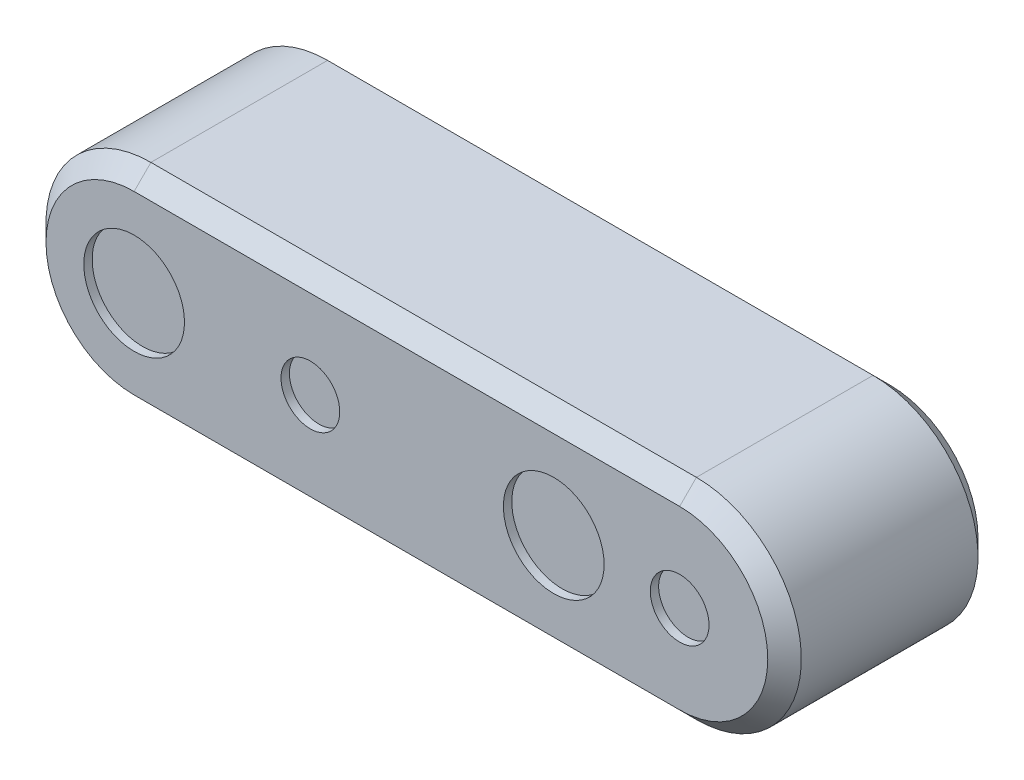
ISO-10303-21;
HEADER;
FILE_DESCRIPTION(('STEP AP214'),'2;1');
FILE_NAME('part.step','',(''),(''),'','','');
FILE_SCHEMA(('AUTOMOTIVE_DESIGN { 1 0 10303 214 1 1 1 1 }'));
ENDSEC;
DATA;
#1=APPLICATION_CONTEXT('core data for automotive mechanical design processes');
#2=APPLICATION_PROTOCOL_DEFINITION('international standard','automotive_design',2000,#1);
#3=PRODUCT_CONTEXT('',#1,'mechanical');
#4=PRODUCT('Part','Part','',(#3));
#5=PRODUCT_RELATED_PRODUCT_CATEGORY('part','',(#4));
#6=PRODUCT_DEFINITION_FORMATION('','',#4);
#7=PRODUCT_DEFINITION_CONTEXT('part definition',#1,'design');
#8=PRODUCT_DEFINITION('design','',#6,#7);
#9=PRODUCT_DEFINITION_SHAPE('','',#8);
#10=(LENGTH_UNIT() NAMED_UNIT(*) SI_UNIT(.MILLI.,.METRE.));
#11=(NAMED_UNIT(*) PLANE_ANGLE_UNIT() SI_UNIT($,.RADIAN.));
#12=(NAMED_UNIT(*) SI_UNIT($,.STERADIAN.) SOLID_ANGLE_UNIT());
#13=UNCERTAINTY_MEASURE_WITH_UNIT(LENGTH_MEASURE(1.E-05),#10,'distance_accuracy_value','');
#14=(GEOMETRIC_REPRESENTATION_CONTEXT(3) GLOBAL_UNCERTAINTY_ASSIGNED_CONTEXT((#13)) GLOBAL_UNIT_ASSIGNED_CONTEXT((#10,
#11,#12)) REPRESENTATION_CONTEXT('',''));
#15=CARTESIAN_POINT('',(0.,0.,0.));
#16=DIRECTION('',(0.,0.,1.));
#17=DIRECTION('',(1.,0.,0.));
#18=AXIS2_PLACEMENT_3D('',#15,#16,#17);
#19=CARTESIAN_POINT('',(-32.5,0.,-12.525));
#20=DIRECTION('',(0.,0.,1.));
#21=DIRECTION('',(1.,0.,0.));
#22=AXIS2_PLACEMENT_3D('',#19,#20,#21);
#23=CYLINDRICAL_SURFACE('',#22,12.5);
#24=DIRECTION('',(0.,0.,1.));
#25=VECTOR('',#24,1.);
#26=CARTESIAN_POINT('',(-32.5,12.5,-12.525));
#27=LINE('',#26,#25);
#28=CARTESIAN_POINT('',(-32.5,12.5,-10.525));
#29=VERTEX_POINT('',#28);
#30=CARTESIAN_POINT('',(-32.5,12.5,10.525));
#31=VERTEX_POINT('',#30);
#32=EDGE_CURVE('E152',#29,#31,#27,.T.);
#33=ORIENTED_EDGE('',*,*,#32,.F.);
#34=CARTESIAN_POINT('',(-32.5,0.,-10.525));
#35=DIRECTION('',(0.,0.,1.));
#36=DIRECTION('',(1.,0.,0.));
#37=AXIS2_PLACEMENT_3D('',#34,#35,#36);
#38=CIRCLE('',#37,12.5);
#39=CARTESIAN_POINT('',(-32.5,-12.5,-10.525));
#40=VERTEX_POINT('',#39);
#41=EDGE_CURVE('E167',#29,#40,#38,.T.);
#42=ORIENTED_EDGE('',*,*,#41,.T.);
#43=DIRECTION('',(0.,0.,1.));
#44=VECTOR('',#43,1.);
#45=CARTESIAN_POINT('',(-32.5,-12.5,-12.525));
#46=LINE('',#45,#44);
#47=CARTESIAN_POINT('',(-32.5,-12.5,10.525));
#48=VERTEX_POINT('',#47);
#49=EDGE_CURVE('E143',#40,#48,#46,.T.);
#50=ORIENTED_EDGE('',*,*,#49,.T.);
#51=CARTESIAN_POINT('',(-32.5,0.,10.525));
#52=DIRECTION('',(0.,0.,1.));
#53=DIRECTION('',(1.,0.,0.));
#54=AXIS2_PLACEMENT_3D('',#51,#52,#53);
#55=CIRCLE('',#54,12.5);
#56=EDGE_CURVE('E133',#48,#31,#55,.F.);
#57=ORIENTED_EDGE('',*,*,#56,.T.);
#58=EDGE_LOOP('',(#33,#42,#50,#57));
#59=FACE_BOUND('',#58,.T.);
#60=ADVANCED_FACE('F42',(#59),#23,.T.);
#61=CARTESIAN_POINT('',(-32.5,12.5,-12.525));
#62=DIRECTION('',(0.,1.,0.));
#63=DIRECTION('',(0.,0.,1.));
#64=AXIS2_PLACEMENT_3D('',#61,#62,#63);
#65=PLANE('',#64);
#66=DIRECTION('',(0.,0.,1.));
#67=VECTOR('',#66,1.);
#68=CARTESIAN_POINT('',(32.5,12.5,-12.525));
#69=LINE('',#68,#67);
#70=CARTESIAN_POINT('',(32.5,12.5,-10.525));
#71=VERTEX_POINT('',#70);
#72=CARTESIAN_POINT('',(32.5,12.5,10.525));
#73=VERTEX_POINT('',#72);
#74=EDGE_CURVE('E150',#71,#73,#69,.T.);
#75=ORIENTED_EDGE('',*,*,#74,.F.);
#76=DIRECTION('',(-1.,0.,0.));
#77=VECTOR('',#76,1.);
#78=CARTESIAN_POINT('',(-32.5,12.5,-10.525));
#79=LINE('',#78,#77);
#80=EDGE_CURVE('E171',#71,#29,#79,.T.);
#81=ORIENTED_EDGE('',*,*,#80,.T.);
#82=ORIENTED_EDGE('',*,*,#32,.T.);
#83=DIRECTION('',(1.,0.,0.));
#84=VECTOR('',#83,1.);
#85=CARTESIAN_POINT('',(-32.5,12.5,10.525));
#86=LINE('',#85,#84);
#87=EDGE_CURVE('E169',#31,#73,#86,.T.);
#88=ORIENTED_EDGE('',*,*,#87,.T.);
#89=EDGE_LOOP('',(#75,#81,#82,#88));
#90=FACE_BOUND('',#89,.T.);
#91=ADVANCED_FACE('F199',(#90),#65,.T.);
#92=CARTESIAN_POINT('',(32.5,0.,-12.525));
#93=DIRECTION('',(0.,0.,1.));
#94=DIRECTION('',(1.,0.,0.));
#95=AXIS2_PLACEMENT_3D('',#92,#93,#94);
#96=CYLINDRICAL_SURFACE('',#95,12.5);
#97=DIRECTION('',(0.,0.,1.));
#98=VECTOR('',#97,1.);
#99=CARTESIAN_POINT('',(32.5,-12.5,-12.525));
#100=LINE('',#99,#98);
#101=CARTESIAN_POINT('',(32.5,-12.5,-10.525));
#102=VERTEX_POINT('',#101);
#103=CARTESIAN_POINT('',(32.5,-12.5,10.525));
#104=VERTEX_POINT('',#103);
#105=EDGE_CURVE('E141',#102,#104,#100,.T.);
#106=ORIENTED_EDGE('',*,*,#105,.F.);
#107=CARTESIAN_POINT('',(32.5,0.,-10.525));
#108=DIRECTION('',(0.,0.,1.));
#109=DIRECTION('',(1.,0.,0.));
#110=AXIS2_PLACEMENT_3D('',#107,#108,#109);
#111=CIRCLE('',#110,12.5);
#112=EDGE_CURVE('E125',#102,#71,#111,.T.);
#113=ORIENTED_EDGE('',*,*,#112,.T.);
#114=ORIENTED_EDGE('',*,*,#74,.T.);
#115=CARTESIAN_POINT('',(32.5,0.,10.525));
#116=DIRECTION('',(0.,0.,1.));
#117=DIRECTION('',(1.,0.,0.));
#118=AXIS2_PLACEMENT_3D('',#115,#116,#117);
#119=CIRCLE('',#118,12.5);
#120=EDGE_CURVE('E134',#73,#104,#119,.F.);
#121=ORIENTED_EDGE('',*,*,#120,.T.);
#122=EDGE_LOOP('',(#106,#113,#114,#121));
#123=FACE_BOUND('',#122,.T.);
#124=ADVANCED_FACE('F148',(#123),#96,.T.);
#125=CARTESIAN_POINT('',(-32.5,-12.5,-12.525));
#126=DIRECTION('',(0.,-1.,0.));
#127=DIRECTION('',(0.,0.,-1.));
#128=AXIS2_PLACEMENT_3D('',#125,#126,#127);
#129=PLANE('',#128);
#130=ORIENTED_EDGE('',*,*,#49,.F.);
#131=DIRECTION('',(1.,0.,0.));
#132=VECTOR('',#131,1.);
#133=CARTESIAN_POINT('',(32.5,-12.5,-10.525));
#134=LINE('',#133,#132);
#135=EDGE_CURVE('E117',#40,#102,#134,.T.);
#136=ORIENTED_EDGE('',*,*,#135,.T.);
#137=ORIENTED_EDGE('',*,*,#105,.T.);
#138=DIRECTION('',(-1.,0.,0.));
#139=VECTOR('',#138,1.);
#140=CARTESIAN_POINT('',(-32.5,-12.5,10.525));
#141=LINE('',#140,#139);
#142=EDGE_CURVE('E146',#104,#48,#141,.T.);
#143=ORIENTED_EDGE('',*,*,#142,.T.);
#144=EDGE_LOOP('',(#130,#136,#137,#143));
#145=FACE_BOUND('',#144,.T.);
#146=ADVANCED_FACE('F139',(#145),#129,.T.);
#147=CARTESIAN_POINT('',(-32.5,0.,-12.525));
#148=DIRECTION('',(0.,0.,1.));
#149=DIRECTION('',(1.,0.,0.));
#150=AXIS2_PLACEMENT_3D('',#147,#148,#149);
#151=PLANE('',#150);
#152=CARTESIAN_POINT('',(32.5,0.,-12.525));
#153=DIRECTION('',(0.,0.,1.));
#154=DIRECTION('',(1.,0.,0.));
#155=AXIS2_PLACEMENT_3D('',#152,#153,#154);
#156=CIRCLE('',#155,10.5);
#157=CARTESIAN_POINT('',(32.5,10.5,-12.525));
#158=VERTEX_POINT('',#157);
#159=CARTESIAN_POINT('',(32.5,-10.5,-12.525));
#160=VERTEX_POINT('',#159);
#161=EDGE_CURVE('E162',#158,#160,#156,.F.);
#162=ORIENTED_EDGE('',*,*,#161,.T.);
#163=DIRECTION('',(-1.,0.,0.));
#164=VECTOR('',#163,1.);
#165=CARTESIAN_POINT('',(-32.5,-10.5,-12.525));
#166=LINE('',#165,#164);
#167=CARTESIAN_POINT('',(-32.5,-10.5,-12.525));
#168=VERTEX_POINT('',#167);
#169=EDGE_CURVE('E119',#160,#168,#166,.T.);
#170=ORIENTED_EDGE('',*,*,#169,.T.);
#171=CARTESIAN_POINT('',(-32.5,0.,-12.525));
#172=DIRECTION('',(0.,0.,1.));
#173=DIRECTION('',(1.,0.,0.));
#174=AXIS2_PLACEMENT_3D('',#171,#172,#173);
#175=CIRCLE('',#174,10.5);
#176=CARTESIAN_POINT('',(-32.5,10.5,-12.525));
#177=VERTEX_POINT('',#176);
#178=EDGE_CURVE('E160',#168,#177,#175,.F.);
#179=ORIENTED_EDGE('',*,*,#178,.T.);
#180=DIRECTION('',(1.,0.,0.));
#181=VECTOR('',#180,1.);
#182=CARTESIAN_POINT('',(32.5,10.5,-12.525));
#183=LINE('',#182,#181);
#184=EDGE_CURVE('E145',#177,#158,#183,.T.);
#185=ORIENTED_EDGE('',*,*,#184,.T.);
#186=EDGE_LOOP('',(#162,#170,#179,#185));
#187=FACE_BOUND('',#186,.T.);
#188=CARTESIAN_POINT('',(22.5,0.,-12.525));
#189=DIRECTION('',(0.,0.,-1.));
#190=DIRECTION('',(-1.,0.,0.));
#191=AXIS2_PLACEMENT_3D('',#188,#189,#190);
#192=CIRCLE('',#191,1.6);
#193=CARTESIAN_POINT('',(20.9,0.,-12.525));
#194=VERTEX_POINT('',#193);
#195=EDGE_CURVE('E234',#194,#194,#192,.T.);
#196=ORIENTED_EDGE('',*,*,#195,.F.);
#197=EDGE_LOOP('',(#196));
#198=FACE_BOUND('',#197,.T.);
#199=CARTESIAN_POINT('',(-22.5,0.,-12.525));
#200=DIRECTION('',(0.,0.,-1.));
#201=DIRECTION('',(-1.,0.,0.));
#202=AXIS2_PLACEMENT_3D('',#199,#200,#201);
#203=CIRCLE('',#202,1.6);
#204=CARTESIAN_POINT('',(-24.1,0.,-12.525));
#205=VERTEX_POINT('',#204);
#206=EDGE_CURVE('E231',#205,#205,#203,.T.);
#207=ORIENTED_EDGE('',*,*,#206,.F.);
#208=EDGE_LOOP('',(#207));
#209=FACE_BOUND('',#208,.T.);
#210=ADVANCED_FACE('F249',(#187,#198,#209),#151,.F.);
#211=CARTESIAN_POINT('',(-32.5,0.,12.525));
#212=DIRECTION('',(0.,0.,1.));
#213=DIRECTION('',(1.,0.,0.));
#214=AXIS2_PLACEMENT_3D('',#211,#212,#213);
#215=PLANE('',#214);
#216=CARTESIAN_POINT('',(-32.5,0.,12.525));
#217=DIRECTION('',(0.,0.,1.));
#218=DIRECTION('',(1.,0.,0.));
#219=AXIS2_PLACEMENT_3D('',#216,#217,#218);
#220=CIRCLE('',#219,10.5);
#221=CARTESIAN_POINT('',(-32.5,10.5,12.525));
#222=VERTEX_POINT('',#221);
#223=CARTESIAN_POINT('',(-32.5,-10.5,12.525));
#224=VERTEX_POINT('',#223);
#225=EDGE_CURVE('E67',#222,#224,#220,.T.);
#226=ORIENTED_EDGE('',*,*,#225,.T.);
#227=DIRECTION('',(1.,0.,0.));
#228=VECTOR('',#227,1.);
#229=CARTESIAN_POINT('',(-32.5,-10.5,12.525));
#230=LINE('',#229,#228);
#231=CARTESIAN_POINT('',(32.5,-10.5,12.525));
#232=VERTEX_POINT('',#231);
#233=EDGE_CURVE('E11',#224,#232,#230,.T.);
#234=ORIENTED_EDGE('',*,*,#233,.T.);
#235=CARTESIAN_POINT('',(32.5,0.,12.525));
#236=DIRECTION('',(0.,0.,1.));
#237=DIRECTION('',(1.,0.,0.));
#238=AXIS2_PLACEMENT_3D('',#235,#236,#237);
#239=CIRCLE('',#238,10.5);
#240=CARTESIAN_POINT('',(32.5,10.5,12.525));
#241=VERTEX_POINT('',#240);
#242=EDGE_CURVE('E52',#232,#241,#239,.T.);
#243=ORIENTED_EDGE('',*,*,#242,.T.);
#244=DIRECTION('',(-1.,0.,0.));
#245=VECTOR('',#244,1.);
#246=CARTESIAN_POINT('',(-32.5,10.5,12.525));
#247=LINE('',#246,#245);
#248=EDGE_CURVE('E173',#241,#222,#247,.T.);
#249=ORIENTED_EDGE('',*,*,#248,.T.);
#250=EDGE_LOOP('',(#226,#234,#243,#249));
#251=FACE_BOUND('',#250,.T.);
#252=CARTESIAN_POINT('',(-32.5,0.,12.525));
#253=DIRECTION('',(0.,0.,1.));
#254=DIRECTION('',(1.,0.,0.));
#255=AXIS2_PLACEMENT_3D('',#252,#253,#254);
#256=CIRCLE('',#255,6.);
#257=CARTESIAN_POINT('',(-26.5,0.,12.525));
#258=VERTEX_POINT('',#257);
#259=EDGE_CURVE('E224',#258,#258,#256,.T.);
#260=ORIENTED_EDGE('',*,*,#259,.F.);
#261=EDGE_LOOP('',(#260));
#262=FACE_BOUND('',#261,.T.);
#263=CARTESIAN_POINT('',(-11.5,0.,12.525));
#264=DIRECTION('',(0.,0.,1.));
#265=DIRECTION('',(1.,0.,0.));
#266=AXIS2_PLACEMENT_3D('',#263,#264,#265);
#267=CIRCLE('',#266,3.5);
#268=CARTESIAN_POINT('',(-8.,0.,12.525));
#269=VERTEX_POINT('',#268);
#270=EDGE_CURVE('E221',#269,#269,#267,.T.);
#271=ORIENTED_EDGE('',*,*,#270,.F.);
#272=EDGE_LOOP('',(#271));
#273=FACE_BOUND('',#272,.T.);
#274=CARTESIAN_POINT('',(17.5,0.,12.525));
#275=DIRECTION('',(0.,0.,1.));
#276=DIRECTION('',(1.,0.,0.));
#277=AXIS2_PLACEMENT_3D('',#274,#275,#276);
#278=CIRCLE('',#277,6.);
#279=CARTESIAN_POINT('',(23.5,0.,12.525));
#280=VERTEX_POINT('',#279);
#281=EDGE_CURVE('E215',#280,#280,#278,.T.);
#282=ORIENTED_EDGE('',*,*,#281,.F.);
#283=EDGE_LOOP('',(#282));
#284=FACE_BOUND('',#283,.T.);
#285=CARTESIAN_POINT('',(32.5,0.,12.525));
#286=DIRECTION('',(0.,0.,1.));
#287=DIRECTION('',(1.,0.,0.));
#288=AXIS2_PLACEMENT_3D('',#285,#286,#287);
#289=CIRCLE('',#288,3.5);
#290=CARTESIAN_POINT('',(36.,0.,12.525));
#291=VERTEX_POINT('',#290);
#292=EDGE_CURVE('E208',#291,#291,#289,.T.);
#293=ORIENTED_EDGE('',*,*,#292,.F.);
#294=EDGE_LOOP('',(#293));
#295=FACE_BOUND('',#294,.T.);
#296=ADVANCED_FACE('F252',(#251,#262,#273,#284,#295),#215,.T.);
#297=CARTESIAN_POINT('',(32.5,0.,11.525));
#298=DIRECTION('',(0.,0.,1.));
#299=DIRECTION('',(1.,0.,0.));
#300=AXIS2_PLACEMENT_3D('',#297,#298,#299);
#301=CYLINDRICAL_SURFACE('',#300,3.5);
#302=CARTESIAN_POINT('',(32.5,0.,11.525));
#303=DIRECTION('',(0.,0.,1.));
#304=DIRECTION('',(1.,0.,0.));
#305=AXIS2_PLACEMENT_3D('',#302,#303,#304);
#306=CIRCLE('',#305,3.5);
#307=CARTESIAN_POINT('',(36.,0.,11.525));
#308=VERTEX_POINT('',#307);
#309=EDGE_CURVE('E205',#308,#308,#306,.T.);
#310=ORIENTED_EDGE('',*,*,#309,.F.);
#311=EDGE_LOOP('',(#310));
#312=FACE_BOUND('',#311,.T.);
#313=ORIENTED_EDGE('',*,*,#292,.T.);
#314=EDGE_LOOP('',(#313));
#315=FACE_BOUND('',#314,.T.);
#316=ADVANCED_FACE('F433',(#312,#315),#301,.F.);
#317=CARTESIAN_POINT('',(32.5,0.,11.525));
#318=DIRECTION('',(0.,0.,1.));
#319=DIRECTION('',(1.,0.,0.));
#320=AXIS2_PLACEMENT_3D('',#317,#318,#319);
#321=PLANE('',#320);
#322=ORIENTED_EDGE('',*,*,#309,.T.);
#323=EDGE_LOOP('',(#322));
#324=FACE_BOUND('',#323,.T.);
#325=ADVANCED_FACE('F422',(#324),#321,.T.);
#326=CARTESIAN_POINT('',(17.5,0.,11.525));
#327=DIRECTION('',(0.,0.,1.));
#328=DIRECTION('',(1.,0.,0.));
#329=AXIS2_PLACEMENT_3D('',#326,#327,#328);
#330=CYLINDRICAL_SURFACE('',#329,6.);
#331=CARTESIAN_POINT('',(17.5,0.,11.525));
#332=DIRECTION('',(0.,0.,1.));
#333=DIRECTION('',(1.,0.,0.));
#334=AXIS2_PLACEMENT_3D('',#331,#332,#333);
#335=CIRCLE('',#334,6.);
#336=CARTESIAN_POINT('',(23.5,0.,11.525));
#337=VERTEX_POINT('',#336);
#338=EDGE_CURVE('E212',#337,#337,#335,.T.);
#339=ORIENTED_EDGE('',*,*,#338,.F.);
#340=EDGE_LOOP('',(#339));
#341=FACE_BOUND('',#340,.T.);
#342=ORIENTED_EDGE('',*,*,#281,.T.);
#343=EDGE_LOOP('',(#342));
#344=FACE_BOUND('',#343,.T.);
#345=ADVANCED_FACE('F411',(#341,#344),#330,.F.);
#346=CARTESIAN_POINT('',(17.5,0.,11.525));
#347=DIRECTION('',(0.,0.,1.));
#348=DIRECTION('',(1.,0.,0.));
#349=AXIS2_PLACEMENT_3D('',#346,#347,#348);
#350=PLANE('',#349);
#351=ORIENTED_EDGE('',*,*,#338,.T.);
#352=EDGE_LOOP('',(#351));
#353=FACE_BOUND('',#352,.T.);
#354=ADVANCED_FACE('F400',(#353),#350,.T.);
#355=CARTESIAN_POINT('',(-11.5,0.,11.525));
#356=DIRECTION('',(0.,0.,1.));
#357=DIRECTION('',(1.,0.,0.));
#358=AXIS2_PLACEMENT_3D('',#355,#356,#357);
#359=CYLINDRICAL_SURFACE('',#358,3.5);
#360=CARTESIAN_POINT('',(-11.5,0.,11.525));
#361=DIRECTION('',(0.,0.,1.));
#362=DIRECTION('',(1.,0.,0.));
#363=AXIS2_PLACEMENT_3D('',#360,#361,#362);
#364=CIRCLE('',#363,3.5);
#365=CARTESIAN_POINT('',(-8.,0.,11.525));
#366=VERTEX_POINT('',#365);
#367=EDGE_CURVE('E218',#366,#366,#364,.T.);
#368=ORIENTED_EDGE('',*,*,#367,.F.);
#369=EDGE_LOOP('',(#368));
#370=FACE_BOUND('',#369,.T.);
#371=ORIENTED_EDGE('',*,*,#270,.T.);
#372=EDGE_LOOP('',(#371));
#373=FACE_BOUND('',#372,.T.);
#374=ADVANCED_FACE('F389',(#370,#373),#359,.F.);
#375=CARTESIAN_POINT('',(-11.5,0.,11.525));
#376=DIRECTION('',(0.,0.,1.));
#377=DIRECTION('',(1.,0.,0.));
#378=AXIS2_PLACEMENT_3D('',#375,#376,#377);
#379=PLANE('',#378);
#380=ORIENTED_EDGE('',*,*,#367,.T.);
#381=EDGE_LOOP('',(#380));
#382=FACE_BOUND('',#381,.T.);
#383=ADVANCED_FACE('F378',(#382),#379,.T.);
#384=CARTESIAN_POINT('',(-32.5,0.,11.525));
#385=DIRECTION('',(0.,0.,1.));
#386=DIRECTION('',(1.,0.,0.));
#387=AXIS2_PLACEMENT_3D('',#384,#385,#386);
#388=CYLINDRICAL_SURFACE('',#387,6.);
#389=CARTESIAN_POINT('',(-32.5,0.,11.525));
#390=DIRECTION('',(0.,0.,1.));
#391=DIRECTION('',(1.,0.,0.));
#392=AXIS2_PLACEMENT_3D('',#389,#390,#391);
#393=CIRCLE('',#392,6.);
#394=CARTESIAN_POINT('',(-26.5,0.,11.525));
#395=VERTEX_POINT('',#394);
#396=EDGE_CURVE('E154',#395,#395,#393,.T.);
#397=ORIENTED_EDGE('',*,*,#396,.F.);
#398=EDGE_LOOP('',(#397));
#399=FACE_BOUND('',#398,.T.);
#400=ORIENTED_EDGE('',*,*,#259,.T.);
#401=EDGE_LOOP('',(#400));
#402=FACE_BOUND('',#401,.T.);
#403=ADVANCED_FACE('F268',(#399,#402),#388,.F.);
#404=CARTESIAN_POINT('',(-32.5,0.,11.525));
#405=DIRECTION('',(0.,0.,1.));
#406=DIRECTION('',(1.,0.,0.));
#407=AXIS2_PLACEMENT_3D('',#404,#405,#406);
#408=PLANE('',#407);
#409=ORIENTED_EDGE('',*,*,#396,.T.);
#410=EDGE_LOOP('',(#409));
#411=FACE_BOUND('',#410,.T.);
#412=ADVANCED_FACE('F259',(#411),#408,.T.);
#413=CARTESIAN_POINT('',(-22.5,0.,-9.525));
#414=DIRECTION('',(0.,0.,-1.));
#415=DIRECTION('',(-1.,0.,0.));
#416=AXIS2_PLACEMENT_3D('',#413,#414,#415);
#417=CYLINDRICAL_SURFACE('',#416,1.6);
#418=CARTESIAN_POINT('',(-22.5,0.,-9.525));
#419=DIRECTION('',(0.,0.,-1.));
#420=DIRECTION('',(-1.,0.,0.));
#421=AXIS2_PLACEMENT_3D('',#418,#419,#420);
#422=CIRCLE('',#421,1.6);
#423=CARTESIAN_POINT('',(-24.1,0.,-9.525));
#424=VERTEX_POINT('',#423);
#425=EDGE_CURVE('E182',#424,#424,#422,.T.);
#426=ORIENTED_EDGE('',*,*,#425,.F.);
#427=EDGE_LOOP('',(#426));
#428=FACE_BOUND('',#427,.T.);
#429=ORIENTED_EDGE('',*,*,#206,.T.);
#430=EDGE_LOOP('',(#429));
#431=FACE_BOUND('',#430,.T.);
#432=ADVANCED_FACE('F257',(#428,#431),#417,.F.);
#433=CARTESIAN_POINT('',(-22.5,0.,-9.525));
#434=DIRECTION('',(0.,0.,-1.));
#435=DIRECTION('',(-1.,0.,0.));
#436=AXIS2_PLACEMENT_3D('',#433,#434,#435);
#437=PLANE('',#436);
#438=ORIENTED_EDGE('',*,*,#425,.T.);
#439=EDGE_LOOP('',(#438));
#440=FACE_BOUND('',#439,.T.);
#441=ADVANCED_FACE('F245',(#440),#437,.T.);
#442=CARTESIAN_POINT('',(22.5,0.,-9.525));
#443=DIRECTION('',(0.,0.,-1.));
#444=DIRECTION('',(-1.,0.,0.));
#445=AXIS2_PLACEMENT_3D('',#442,#443,#444);
#446=CYLINDRICAL_SURFACE('',#445,1.6);
#447=CARTESIAN_POINT('',(22.5,0.,-9.525));
#448=DIRECTION('',(0.,0.,-1.));
#449=DIRECTION('',(-1.,0.,0.));
#450=AXIS2_PLACEMENT_3D('',#447,#448,#449);
#451=CIRCLE('',#450,1.6);
#452=CARTESIAN_POINT('',(20.9,0.,-9.525));
#453=VERTEX_POINT('',#452);
#454=EDGE_CURVE('E209',#453,#453,#451,.T.);
#455=ORIENTED_EDGE('',*,*,#454,.F.);
#456=EDGE_LOOP('',(#455));
#457=FACE_BOUND('',#456,.T.);
#458=ORIENTED_EDGE('',*,*,#195,.T.);
#459=EDGE_LOOP('',(#458));
#460=FACE_BOUND('',#459,.T.);
#461=ADVANCED_FACE('F242',(#457,#460),#446,.F.);
#462=CARTESIAN_POINT('',(22.5,0.,-9.525));
#463=DIRECTION('',(0.,0.,-1.));
#464=DIRECTION('',(-1.,0.,0.));
#465=AXIS2_PLACEMENT_3D('',#462,#463,#464);
#466=PLANE('',#465);
#467=ORIENTED_EDGE('',*,*,#454,.T.);
#468=EDGE_LOOP('',(#467));
#469=FACE_BOUND('',#468,.T.);
#470=ADVANCED_FACE('F240',(#469),#466,.T.);
#471=CARTESIAN_POINT('',(-32.5,12.5,-10.525));
#472=DIRECTION('',(0.,0.707106781186545,-0.70710678118655));
#473=DIRECTION('',(1.,0.,0.));
#474=AXIS2_PLACEMENT_3D('',#471,#472,#473);
#475=PLANE('',#474);
#476=DIRECTION('',(0.,0.70710678118655,0.707106781186545));
#477=VECTOR('',#476,1.);
#478=CARTESIAN_POINT('',(32.5,10.5,-12.525));
#479=LINE('',#478,#477);
#480=EDGE_CURVE('E128',#158,#71,#479,.T.);
#481=ORIENTED_EDGE('',*,*,#480,.F.);
#482=ORIENTED_EDGE('',*,*,#184,.F.);
#483=DIRECTION('',(0.,-0.70710678118655,-0.707106781186545));
#484=VECTOR('',#483,1.);
#485=CARTESIAN_POINT('',(-32.5,12.5,-10.525));
#486=LINE('',#485,#484);
#487=EDGE_CURVE('E179',#29,#177,#486,.T.);
#488=ORIENTED_EDGE('',*,*,#487,.F.);
#489=ORIENTED_EDGE('',*,*,#80,.F.);
#490=EDGE_LOOP('',(#481,#482,#488,#489));
#491=FACE_BOUND('',#490,.T.);
#492=ADVANCED_FACE('F298',(#491),#475,.T.);
#493=CARTESIAN_POINT('',(-32.5,0.,-10.525));
#494=DIRECTION('',(0.,0.,1.));
#495=DIRECTION('',(1.,0.,0.));
#496=AXIS2_PLACEMENT_3D('',#493,#494,#495);
#497=CONICAL_SURFACE('',#496,12.5,0.785398163397452);
#498=ORIENTED_EDGE('',*,*,#487,.T.);
#499=ORIENTED_EDGE('',*,*,#178,.F.);
#500=DIRECTION('',(0.,0.70710678118655,-0.707106781186545));
#501=VECTOR('',#500,1.);
#502=CARTESIAN_POINT('',(-32.5,-12.5,-10.525));
#503=LINE('',#502,#501);
#504=EDGE_CURVE('E122',#40,#168,#503,.T.);
#505=ORIENTED_EDGE('',*,*,#504,.F.);
#506=ORIENTED_EDGE('',*,*,#41,.F.);
#507=EDGE_LOOP('',(#498,#499,#505,#506));
#508=FACE_BOUND('',#507,.T.);
#509=ADVANCED_FACE('F292',(#508),#497,.T.);
#510=CARTESIAN_POINT('',(32.5,0.,-10.525));
#511=DIRECTION('',(0.,0.,1.));
#512=DIRECTION('',(1.,0.,0.));
#513=AXIS2_PLACEMENT_3D('',#510,#511,#512);
#514=CONICAL_SURFACE('',#513,12.5,0.785398163397452);
#515=ORIENTED_EDGE('',*,*,#480,.T.);
#516=ORIENTED_EDGE('',*,*,#112,.F.);
#517=DIRECTION('',(0.,-0.70710678118655,0.707106781186545));
#518=VECTOR('',#517,1.);
#519=CARTESIAN_POINT('',(32.5,-10.5,-12.525));
#520=LINE('',#519,#518);
#521=EDGE_CURVE('E113',#160,#102,#520,.T.);
#522=ORIENTED_EDGE('',*,*,#521,.F.);
#523=ORIENTED_EDGE('',*,*,#161,.F.);
#524=EDGE_LOOP('',(#515,#516,#522,#523));
#525=FACE_BOUND('',#524,.T.);
#526=ADVANCED_FACE('F126',(#525),#514,.T.);
#527=CARTESIAN_POINT('',(-32.5,-12.5,-10.525));
#528=DIRECTION('',(0.,-0.707106781186545,-0.70710678118655));
#529=DIRECTION('',(-1.,0.,0.));
#530=AXIS2_PLACEMENT_3D('',#527,#528,#529);
#531=PLANE('',#530);
#532=ORIENTED_EDGE('',*,*,#504,.T.);
#533=ORIENTED_EDGE('',*,*,#169,.F.);
#534=ORIENTED_EDGE('',*,*,#521,.T.);
#535=ORIENTED_EDGE('',*,*,#135,.F.);
#536=EDGE_LOOP('',(#532,#533,#534,#535));
#537=FACE_BOUND('',#536,.T.);
#538=ADVANCED_FACE('F115',(#537),#531,.T.);
#539=CARTESIAN_POINT('',(-32.5,10.5,12.525));
#540=DIRECTION('',(0.,-0.70710678118655,-0.707106781186545));
#541=DIRECTION('',(-1.,0.,0.));
#542=AXIS2_PLACEMENT_3D('',#539,#540,#541);
#543=PLANE('',#542);
#544=DIRECTION('',(0.,-0.707106781186545,0.70710678118655));
#545=VECTOR('',#544,1.);
#546=CARTESIAN_POINT('',(32.5,12.5,10.525));
#547=LINE('',#546,#545);
#548=EDGE_CURVE('E185',#73,#241,#547,.T.);
#549=ORIENTED_EDGE('',*,*,#548,.F.);
#550=ORIENTED_EDGE('',*,*,#87,.F.);
#551=DIRECTION('',(0.,0.707106781186545,-0.70710678118655));
#552=VECTOR('',#551,1.);
#553=CARTESIAN_POINT('',(-32.5,10.5,12.525));
#554=LINE('',#553,#552);
#555=EDGE_CURVE('E47',#222,#31,#554,.T.);
#556=ORIENTED_EDGE('',*,*,#555,.F.);
#557=ORIENTED_EDGE('',*,*,#248,.F.);
#558=EDGE_LOOP('',(#549,#550,#556,#557));
#559=FACE_BOUND('',#558,.T.);
#560=ADVANCED_FACE('F45',(#559),#543,.F.);
#561=CARTESIAN_POINT('',(-32.5,0.,12.525));
#562=DIRECTION('',(0.,0.,-1.));
#563=DIRECTION('',(-1.,0.,0.));
#564=AXIS2_PLACEMENT_3D('',#561,#562,#563);
#565=CONICAL_SURFACE('',#564,10.5,0.785398163397445);
#566=ORIENTED_EDGE('',*,*,#555,.T.);
#567=ORIENTED_EDGE('',*,*,#56,.F.);
#568=DIRECTION('',(0.,-0.707106781186545,-0.70710678118655));
#569=VECTOR('',#568,1.);
#570=CARTESIAN_POINT('',(-32.5,-10.5,12.525));
#571=LINE('',#570,#569);
#572=EDGE_CURVE('E184',#224,#48,#571,.T.);
#573=ORIENTED_EDGE('',*,*,#572,.F.);
#574=ORIENTED_EDGE('',*,*,#225,.F.);
#575=EDGE_LOOP('',(#566,#567,#573,#574));
#576=FACE_BOUND('',#575,.T.);
#577=ADVANCED_FACE('F193',(#576),#565,.T.);
#578=CARTESIAN_POINT('',(32.5,0.,12.525));
#579=DIRECTION('',(0.,0.,-1.));
#580=DIRECTION('',(-1.,0.,0.));
#581=AXIS2_PLACEMENT_3D('',#578,#579,#580);
#582=CONICAL_SURFACE('',#581,10.5,0.785398163397445);
#583=ORIENTED_EDGE('',*,*,#548,.T.);
#584=ORIENTED_EDGE('',*,*,#242,.F.);
#585=DIRECTION('',(0.,0.707106781186545,0.70710678118655));
#586=VECTOR('',#585,1.);
#587=CARTESIAN_POINT('',(32.5,-12.5,10.525));
#588=LINE('',#587,#586);
#589=EDGE_CURVE('E60',#104,#232,#588,.T.);
#590=ORIENTED_EDGE('',*,*,#589,.F.);
#591=ORIENTED_EDGE('',*,*,#120,.F.);
#592=EDGE_LOOP('',(#583,#584,#590,#591));
#593=FACE_BOUND('',#592,.T.);
#594=ADVANCED_FACE('F312',(#593),#582,.T.);
#595=CARTESIAN_POINT('',(-32.5,-10.5,12.525));
#596=DIRECTION('',(0.,0.70710678118655,-0.707106781186545));
#597=DIRECTION('',(1.,0.,0.));
#598=AXIS2_PLACEMENT_3D('',#595,#596,#597);
#599=PLANE('',#598);
#600=ORIENTED_EDGE('',*,*,#572,.T.);
#601=ORIENTED_EDGE('',*,*,#142,.F.);
#602=ORIENTED_EDGE('',*,*,#589,.T.);
#603=ORIENTED_EDGE('',*,*,#233,.F.);
#604=EDGE_LOOP('',(#600,#601,#602,#603));
#605=FACE_BOUND('',#604,.T.);
#606=ADVANCED_FACE('F306',(#605),#599,.F.);
#607=CLOSED_SHELL('',(#60,#91,#124,#146,#210,#296,#316,#325,#345,#354,#374,#383,#403,#412,#432,
#441,#461,#470,#492,#509,#526,#538,#560,#577,#594,#606));
#608=MANIFOLD_SOLID_BREP('B2',#607);
#609=ADVANCED_BREP_SHAPE_REPRESENTATION('',(#18,#608),#14);
#610=SHAPE_DEFINITION_REPRESENTATION(#9,#609);
ENDSEC;
END-ISO-10303-21;
